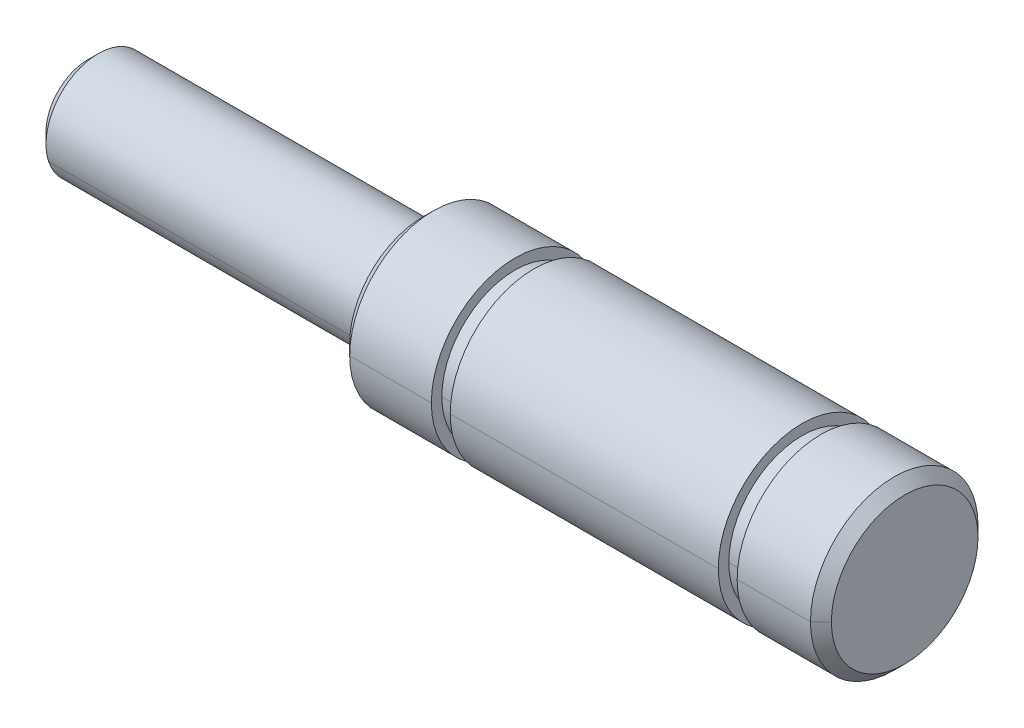
ISO-10303-21;
HEADER;
FILE_DESCRIPTION(('STEP AP214'),'2;1');
FILE_NAME('part.step','',(''),(''),'','','');
FILE_SCHEMA(('AUTOMOTIVE_DESIGN { 1 0 10303 214 1 1 1 1 }'));
ENDSEC;
DATA;
#1=APPLICATION_CONTEXT('core data for automotive mechanical design processes');
#2=APPLICATION_PROTOCOL_DEFINITION('international standard','automotive_design',2000,#1);
#3=PRODUCT_CONTEXT('',#1,'mechanical');
#4=PRODUCT('Part','Part','',(#3));
#5=PRODUCT_RELATED_PRODUCT_CATEGORY('part','',(#4));
#6=PRODUCT_DEFINITION_FORMATION('','',#4);
#7=PRODUCT_DEFINITION_CONTEXT('part definition',#1,'design');
#8=PRODUCT_DEFINITION('design','',#6,#7);
#9=PRODUCT_DEFINITION_SHAPE('','',#8);
#10=(LENGTH_UNIT() NAMED_UNIT(*) SI_UNIT(.MILLI.,.METRE.));
#11=(NAMED_UNIT(*) PLANE_ANGLE_UNIT() SI_UNIT($,.RADIAN.));
#12=(NAMED_UNIT(*) SI_UNIT($,.STERADIAN.) SOLID_ANGLE_UNIT());
#13=UNCERTAINTY_MEASURE_WITH_UNIT(LENGTH_MEASURE(1.E-05),#10,'distance_accuracy_value','');
#14=(GEOMETRIC_REPRESENTATION_CONTEXT(3) GLOBAL_UNCERTAINTY_ASSIGNED_CONTEXT((#13)) GLOBAL_UNIT_ASSIGNED_CONTEXT((#10,
#11,#12)) REPRESENTATION_CONTEXT('',''));
#15=CARTESIAN_POINT('',(0.,0.,0.));
#16=DIRECTION('',(0.,0.,1.));
#17=DIRECTION('',(1.,0.,0.));
#18=AXIS2_PLACEMENT_3D('',#15,#16,#17);
#19=CARTESIAN_POINT('',(23.,0.,0.));
#20=DIRECTION('',(1.,0.,0.));
#21=DIRECTION('',(0.,1.,0.));
#22=AXIS2_PLACEMENT_3D('',#19,#20,#21);
#23=CYLINDRICAL_SURFACE('',#22,4.);
#24=DIRECTION('',(1.,0.,0.));
#25=VECTOR('',#24,1.);
#26=CARTESIAN_POINT('',(5.3,0.,4.));
#27=LINE('',#26,#25);
#28=CARTESIAN_POINT('',(5.3,0.,4.));
#29=VERTEX_POINT('',#28);
#30=CARTESIAN_POINT('',(18.1,0.,4.));
#31=VERTEX_POINT('',#30);
#32=EDGE_CURVE('E11',#29,#31,#27,.T.);
#33=ORIENTED_EDGE('',*,*,#32,.F.);
#34=CARTESIAN_POINT('',(5.3,0.,0.));
#35=DIRECTION('',(1.,0.,0.));
#36=DIRECTION('',(0.,0.,-1.));
#37=AXIS2_PLACEMENT_3D('',#34,#35,#36);
#38=CIRCLE('',#37,4.);
#39=CARTESIAN_POINT('',(5.3,0.,-4.));
#40=VERTEX_POINT('',#39);
#41=EDGE_CURVE('E26',#29,#40,#38,.T.);
#42=ORIENTED_EDGE('',*,*,#41,.T.);
#43=DIRECTION('',(1.,0.,0.));
#44=VECTOR('',#43,1.);
#45=CARTESIAN_POINT('',(5.3,0.,-4.));
#46=LINE('',#45,#44);
#47=CARTESIAN_POINT('',(18.1,0.,-4.));
#48=VERTEX_POINT('',#47);
#49=EDGE_CURVE('E427',#40,#48,#46,.T.);
#50=ORIENTED_EDGE('',*,*,#49,.T.);
#51=CARTESIAN_POINT('',(18.1,0.,0.));
#52=DIRECTION('',(-1.,0.,0.));
#53=DIRECTION('',(0.,0.,1.));
#54=AXIS2_PLACEMENT_3D('',#51,#52,#53);
#55=CIRCLE('',#54,4.);
#56=EDGE_CURVE('E422',#48,#31,#55,.T.);
#57=ORIENTED_EDGE('',*,*,#56,.T.);
#58=EDGE_LOOP('',(#33,#42,#50,#57));
#59=FACE_BOUND('',#58,.T.);
#60=ADVANCED_FACE('F17',(#59),#23,.T.);
#61=CARTESIAN_POINT('',(18.1,8.,0.));
#62=DIRECTION('',(-1.,0.,0.));
#63=DIRECTION('',(0.,0.,1.));
#64=AXIS2_PLACEMENT_3D('',#61,#62,#63);
#65=PLANE('',#64);
#66=CARTESIAN_POINT('',(18.1,0.,0.));
#67=DIRECTION('',(1.,0.,0.));
#68=DIRECTION('',(0.,0.,-1.));
#69=AXIS2_PLACEMENT_3D('',#66,#67,#68);
#70=CIRCLE('',#69,3.5);
#71=CARTESIAN_POINT('',(18.1,0.,3.5));
#72=VERTEX_POINT('',#71);
#73=CARTESIAN_POINT('',(18.1,0.,-3.5));
#74=VERTEX_POINT('',#73);
#75=EDGE_CURVE('E416',#72,#74,#70,.T.);
#76=ORIENTED_EDGE('',*,*,#75,.F.);
#77=CARTESIAN_POINT('',(18.1,0.,0.));
#78=DIRECTION('',(1.,0.,0.));
#79=DIRECTION('',(0.,0.,-1.));
#80=AXIS2_PLACEMENT_3D('',#77,#78,#79);
#81=CIRCLE('',#80,3.5);
#82=EDGE_CURVE('E410',#74,#72,#81,.T.);
#83=ORIENTED_EDGE('',*,*,#82,.F.);
#84=EDGE_LOOP('',(#76,#83));
#85=FACE_BOUND('',#84,.T.);
#86=ORIENTED_EDGE('',*,*,#56,.F.);
#87=CARTESIAN_POINT('',(18.1,0.,0.));
#88=DIRECTION('',(-1.,0.,0.));
#89=DIRECTION('',(0.,0.,1.));
#90=AXIS2_PLACEMENT_3D('',#87,#88,#89);
#91=CIRCLE('',#90,4.);
#92=EDGE_CURVE('E404',#31,#48,#91,.T.);
#93=ORIENTED_EDGE('',*,*,#92,.F.);
#94=EDGE_LOOP('',(#86,#93));
#95=FACE_BOUND('',#94,.T.);
#96=ADVANCED_FACE('F522',(#85,#95),#65,.F.);
#97=CARTESIAN_POINT('',(23.,0.,0.));
#98=DIRECTION('',(1.,0.,0.));
#99=DIRECTION('',(0.,-1.,0.));
#100=AXIS2_PLACEMENT_3D('',#97,#98,#99);
#101=CYLINDRICAL_SURFACE('',#100,4.);
#102=ORIENTED_EDGE('',*,*,#32,.T.);
#103=ORIENTED_EDGE('',*,*,#92,.T.);
#104=ORIENTED_EDGE('',*,*,#49,.F.);
#105=CARTESIAN_POINT('',(5.3,0.,0.));
#106=DIRECTION('',(1.,0.,0.));
#107=DIRECTION('',(0.,0.,-1.));
#108=AXIS2_PLACEMENT_3D('',#105,#106,#107);
#109=CIRCLE('',#108,4.);
#110=EDGE_CURVE('E399',#40,#29,#109,.T.);
#111=ORIENTED_EDGE('',*,*,#110,.T.);
#112=EDGE_LOOP('',(#102,#103,#104,#111));
#113=FACE_BOUND('',#112,.T.);
#114=ADVANCED_FACE('F526',(#113),#101,.T.);
#115=CARTESIAN_POINT('',(5.3,3.5,0.));
#116=DIRECTION('',(1.,0.,0.));
#117=DIRECTION('',(0.,0.,-1.));
#118=AXIS2_PLACEMENT_3D('',#115,#116,#117);
#119=PLANE('',#118);
#120=ORIENTED_EDGE('',*,*,#41,.F.);
#121=ORIENTED_EDGE('',*,*,#110,.F.);
#122=EDGE_LOOP('',(#120,#121));
#123=FACE_BOUND('',#122,.T.);
#124=CARTESIAN_POINT('',(5.3,0.,0.));
#125=DIRECTION('',(1.,0.,0.));
#126=DIRECTION('',(0.,0.,-1.));
#127=AXIS2_PLACEMENT_3D('',#124,#125,#126);
#128=CIRCLE('',#127,3.5);
#129=CARTESIAN_POINT('',(5.3,0.,-3.5));
#130=VERTEX_POINT('',#129);
#131=CARTESIAN_POINT('',(5.3,0.,3.5));
#132=VERTEX_POINT('',#131);
#133=EDGE_CURVE('E394',#130,#132,#128,.T.);
#134=ORIENTED_EDGE('',*,*,#133,.T.);
#135=CARTESIAN_POINT('',(5.3,0.,0.));
#136=DIRECTION('',(1.,0.,0.));
#137=DIRECTION('',(0.,0.,-1.));
#138=AXIS2_PLACEMENT_3D('',#135,#136,#137);
#139=CIRCLE('',#138,3.5);
#140=EDGE_CURVE('E389',#132,#130,#139,.T.);
#141=ORIENTED_EDGE('',*,*,#140,.T.);
#142=EDGE_LOOP('',(#134,#141));
#143=FACE_BOUND('',#142,.T.);
#144=ADVANCED_FACE('F531',(#123,#143),#119,.F.);
#145=CARTESIAN_POINT('',(23.,0.,0.));
#146=DIRECTION('',(1.,0.,0.));
#147=DIRECTION('',(0.,1.,0.));
#148=AXIS2_PLACEMENT_3D('',#145,#146,#147);
#149=CYLINDRICAL_SURFACE('',#148,3.5);
#150=DIRECTION('',(1.,0.,0.));
#151=VECTOR('',#150,1.);
#152=CARTESIAN_POINT('',(4.4,0.,3.5));
#153=LINE('',#152,#151);
#154=CARTESIAN_POINT('',(4.4,0.,3.5));
#155=VERTEX_POINT('',#154);
#156=EDGE_CURVE('E383',#155,#132,#153,.T.);
#157=ORIENTED_EDGE('',*,*,#156,.F.);
#158=CARTESIAN_POINT('',(4.4,0.,0.));
#159=DIRECTION('',(1.,0.,0.));
#160=DIRECTION('',(0.,0.,-1.));
#161=AXIS2_PLACEMENT_3D('',#158,#159,#160);
#162=CIRCLE('',#161,3.5);
#163=CARTESIAN_POINT('',(4.4,0.,-3.5));
#164=VERTEX_POINT('',#163);
#165=EDGE_CURVE('E378',#155,#164,#162,.T.);
#166=ORIENTED_EDGE('',*,*,#165,.T.);
#167=DIRECTION('',(1.,0.,0.));
#168=VECTOR('',#167,1.);
#169=CARTESIAN_POINT('',(4.4,0.,-3.5));
#170=LINE('',#169,#168);
#171=EDGE_CURVE('E372',#164,#130,#170,.T.);
#172=ORIENTED_EDGE('',*,*,#171,.T.);
#173=ORIENTED_EDGE('',*,*,#140,.F.);
#174=EDGE_LOOP('',(#157,#166,#172,#173));
#175=FACE_BOUND('',#174,.T.);
#176=ADVANCED_FACE('F538',(#175),#149,.T.);
#177=CARTESIAN_POINT('',(23.,0.,0.));
#178=DIRECTION('',(1.,0.,0.));
#179=DIRECTION('',(0.,-1.,0.));
#180=AXIS2_PLACEMENT_3D('',#177,#178,#179);
#181=CYLINDRICAL_SURFACE('',#180,3.5);
#182=ORIENTED_EDGE('',*,*,#156,.T.);
#183=ORIENTED_EDGE('',*,*,#133,.F.);
#184=ORIENTED_EDGE('',*,*,#171,.F.);
#185=CARTESIAN_POINT('',(4.4,0.,0.));
#186=DIRECTION('',(1.,0.,0.));
#187=DIRECTION('',(0.,0.,-1.));
#188=AXIS2_PLACEMENT_3D('',#185,#186,#187);
#189=CIRCLE('',#188,3.5);
#190=EDGE_CURVE('E366',#164,#155,#189,.T.);
#191=ORIENTED_EDGE('',*,*,#190,.T.);
#192=EDGE_LOOP('',(#182,#183,#184,#191));
#193=FACE_BOUND('',#192,.T.);
#194=ADVANCED_FACE('F542',(#193),#181,.T.);
#195=CARTESIAN_POINT('',(4.4,8.,0.));
#196=DIRECTION('',(-1.,0.,0.));
#197=DIRECTION('',(0.,0.,1.));
#198=AXIS2_PLACEMENT_3D('',#195,#196,#197);
#199=PLANE('',#198);
#200=ORIENTED_EDGE('',*,*,#165,.F.);
#201=ORIENTED_EDGE('',*,*,#190,.F.);
#202=EDGE_LOOP('',(#200,#201));
#203=FACE_BOUND('',#202,.T.);
#204=CARTESIAN_POINT('',(4.4,0.,0.));
#205=DIRECTION('',(-1.,0.,0.));
#206=DIRECTION('',(0.,0.,1.));
#207=AXIS2_PLACEMENT_3D('',#204,#205,#206);
#208=CIRCLE('',#207,4.);
#209=CARTESIAN_POINT('',(4.4,0.,-4.));
#210=VERTEX_POINT('',#209);
#211=CARTESIAN_POINT('',(4.4,0.,4.));
#212=VERTEX_POINT('',#211);
#213=EDGE_CURVE('E360',#210,#212,#208,.T.);
#214=ORIENTED_EDGE('',*,*,#213,.F.);
#215=CARTESIAN_POINT('',(4.4,0.,0.));
#216=DIRECTION('',(-1.,0.,0.));
#217=DIRECTION('',(0.,0.,1.));
#218=AXIS2_PLACEMENT_3D('',#215,#216,#217);
#219=CIRCLE('',#218,4.);
#220=EDGE_CURVE('E354',#212,#210,#219,.T.);
#221=ORIENTED_EDGE('',*,*,#220,.F.);
#222=EDGE_LOOP('',(#214,#221));
#223=FACE_BOUND('',#222,.T.);
#224=ADVANCED_FACE('F546',(#203,#223),#199,.F.);
#225=CARTESIAN_POINT('',(23.,0.,0.));
#226=DIRECTION('',(1.,0.,0.));
#227=DIRECTION('',(0.,-1.,0.));
#228=AXIS2_PLACEMENT_3D('',#225,#226,#227);
#229=CYLINDRICAL_SURFACE('',#228,4.);
#230=DIRECTION('',(1.,0.,0.));
#231=VECTOR('',#230,1.);
#232=CARTESIAN_POINT('',(0.5,0.,4.));
#233=LINE('',#232,#231);
#234=CARTESIAN_POINT('',(0.5,0.,4.));
#235=VERTEX_POINT('',#234);
#236=EDGE_CURVE('E348',#235,#212,#233,.T.);
#237=ORIENTED_EDGE('',*,*,#236,.T.);
#238=ORIENTED_EDGE('',*,*,#220,.T.);
#239=DIRECTION('',(1.,0.,0.));
#240=VECTOR('',#239,1.);
#241=CARTESIAN_POINT('',(0.5,0.,-4.));
#242=LINE('',#241,#240);
#243=CARTESIAN_POINT('',(0.5,0.,-4.));
#244=VERTEX_POINT('',#243);
#245=EDGE_CURVE('E342',#244,#210,#242,.T.);
#246=ORIENTED_EDGE('',*,*,#245,.F.);
#247=CARTESIAN_POINT('',(0.5,0.,0.));
#248=DIRECTION('',(1.,0.,0.));
#249=DIRECTION('',(0.,0.,-1.));
#250=AXIS2_PLACEMENT_3D('',#247,#248,#249);
#251=CIRCLE('',#250,4.);
#252=EDGE_CURVE('E337',#244,#235,#251,.T.);
#253=ORIENTED_EDGE('',*,*,#252,.T.);
#254=EDGE_LOOP('',(#237,#238,#246,#253));
#255=FACE_BOUND('',#254,.T.);
#256=ADVANCED_FACE('F549',(#255),#229,.T.);
#257=CARTESIAN_POINT('',(0.,0.,0.));
#258=DIRECTION('',(1.,0.,0.));
#259=DIRECTION('',(0.,-1.,0.));
#260=AXIS2_PLACEMENT_3D('',#257,#258,#259);
#261=CONICAL_SURFACE('',#260,3.5,0.785398163397448);
#262=DIRECTION('',(0.707106781186548,0.,0.707106781186547));
#263=VECTOR('',#262,1.);
#264=CARTESIAN_POINT('',(0.,0.,3.5));
#265=LINE('',#264,#263);
#266=CARTESIAN_POINT('',(0.,0.,3.5));
#267=VERTEX_POINT('',#266);
#268=EDGE_CURVE('E331',#267,#235,#265,.T.);
#269=ORIENTED_EDGE('',*,*,#268,.T.);
#270=ORIENTED_EDGE('',*,*,#252,.F.);
#271=DIRECTION('',(0.707106781186548,0.,-0.707106781186547));
#272=VECTOR('',#271,1.);
#273=CARTESIAN_POINT('',(0.,0.,-3.5));
#274=LINE('',#273,#272);
#275=CARTESIAN_POINT('',(0.,0.,-3.5));
#276=VERTEX_POINT('',#275);
#277=EDGE_CURVE('E325',#276,#244,#274,.T.);
#278=ORIENTED_EDGE('',*,*,#277,.F.);
#279=CARTESIAN_POINT('',(0.,0.,0.));
#280=DIRECTION('',(1.,0.,0.));
#281=DIRECTION('',(0.,0.,-1.));
#282=AXIS2_PLACEMENT_3D('',#279,#280,#281);
#283=CIRCLE('',#282,3.5);
#284=EDGE_CURVE('E320',#276,#267,#283,.T.);
#285=ORIENTED_EDGE('',*,*,#284,.T.);
#286=EDGE_LOOP('',(#269,#270,#278,#285));
#287=FACE_BOUND('',#286,.T.);
#288=ADVANCED_FACE('F297',(#287),#261,.T.);
#289=CARTESIAN_POINT('',(0.,2.7,0.));
#290=DIRECTION('',(1.,0.,0.));
#291=DIRECTION('',(0.,0.,-1.));
#292=AXIS2_PLACEMENT_3D('',#289,#290,#291);
#293=PLANE('',#292);
#294=CARTESIAN_POINT('',(0.,0.,0.));
#295=DIRECTION('',(1.,0.,0.));
#296=DIRECTION('',(0.,0.,-1.));
#297=AXIS2_PLACEMENT_3D('',#294,#295,#296);
#298=CIRCLE('',#297,3.5);
#299=EDGE_CURVE('E316',#267,#276,#298,.T.);
#300=ORIENTED_EDGE('',*,*,#299,.F.);
#301=ORIENTED_EDGE('',*,*,#284,.F.);
#302=EDGE_LOOP('',(#300,#301));
#303=FACE_BOUND('',#302,.T.);
#304=CARTESIAN_POINT('',(0.,-2.56785259399692,-0.834345884812358));
#305=CARTESIAN_POINT('',(0.,-2.3054894173888,-1.64070183667632));
#306=CARTESIAN_POINT('',(0.,-1.72788534034163,-2.34633383783401));
#307=CARTESIAN_POINT('',(0.,-0.882106735192525,-2.77618217061076));
#308=CARTESIAN_POINT('',(0.,0.93702599862815,-2.88386948988305));
#309=CARTESIAN_POINT('',(0.,2.34543827718565,-1.72748922561081));
#310=CARTESIAN_POINT('',(0.,2.77702903150137,-0.882598428579526));
#311=CARTESIAN_POINT('',(0.,2.82956046202664,0.0277770102841628));
#312=CARTESIAN_POINT('',(0.,2.56785259399692,0.834345884812357));
#313=B_SPLINE_CURVE_WITH_KNOTS('',5,(#304,#305,#306,#307,#308,#309,#310,#311,#312),
.UNSPECIFIED.,.F.,.F.,(6,3,6),(0.,1.5707963267949,3.14159265358979),.UNSPECIFIED.);
#314=CARTESIAN_POINT('',(0.,-2.56785259399692,-0.834345884812358));
#315=VERTEX_POINT('',#314);
#316=CARTESIAN_POINT('',(0.,2.56785259399692,0.834345884812358));
#317=VERTEX_POINT('',#316);
#318=EDGE_CURVE('E314',#315,#317,#313,.T.);
#319=ORIENTED_EDGE('',*,*,#318,.T.);
#320=CARTESIAN_POINT('',(0.,0.,0.));
#321=DIRECTION('',(1.,0.,0.));
#322=DIRECTION('',(0.,0.,-1.));
#323=AXIS2_PLACEMENT_3D('',#320,#321,#322);
#324=CIRCLE('',#323,2.7);
#325=EDGE_CURVE('E441',#317,#315,#324,.T.);
#326=ORIENTED_EDGE('',*,*,#325,.T.);
#327=EDGE_LOOP('',(#319,#326));
#328=FACE_BOUND('',#327,.T.);
#329=ADVANCED_FACE('F292',(#303,#328),#293,.F.);
#330=CARTESIAN_POINT('',(-0.200000000000015,0.,0.));
#331=DIRECTION('',(1.,0.,0.));
#332=DIRECTION('',(0.,0.309016994374947,-0.951056516295154));
#333=AXIS2_PLACEMENT_3D('',#330,#331,#332);
#334=TOROIDAL_SURFACE('',#333,2.7,0.200000000000015);
#335=CARTESIAN_POINT('',(-0.200000000000015,-2.56785259399692,-0.834345884812357));
#336=DIRECTION('',(0.,0.309016994374948,-0.951056516295154));
#337=DIRECTION('',(0.,0.951056516295154,0.309016994374948));
#338=AXIS2_PLACEMENT_3D('',#335,#336,#337);
#339=CIRCLE('',#338,0.200000000000015);
#340=CARTESIAN_POINT('',(-0.2,-2.37764129073787,-0.772542485937363));
#341=VERTEX_POINT('',#340);
#342=EDGE_CURVE('E443',#341,#315,#339,.T.);
#343=ORIENTED_EDGE('',*,*,#342,.T.);
#344=ORIENTED_EDGE('',*,*,#325,.F.);
#345=CARTESIAN_POINT('',(-0.200000000000015,2.56785259399692,0.834345884812358));
#346=DIRECTION('',(0.,-0.309016994374948,0.951056516295154));
#347=DIRECTION('',(0.,-0.951056516295154,-0.309016994374948));
#348=AXIS2_PLACEMENT_3D('',#345,#346,#347);
#349=CIRCLE('',#348,0.200000000000015);
#350=CARTESIAN_POINT('',(-0.2,2.37764129073787,0.772542485937364));
#351=VERTEX_POINT('',#350);
#352=EDGE_CURVE('E446',#351,#317,#349,.T.);
#353=ORIENTED_EDGE('',*,*,#352,.F.);
#354=CARTESIAN_POINT('',(-0.2,0.,0.));
#355=DIRECTION('',(1.,0.,0.));
#356=DIRECTION('',(0.,0.,-1.));
#357=AXIS2_PLACEMENT_3D('',#354,#355,#356);
#358=CIRCLE('',#357,2.5);
#359=CARTESIAN_POINT('',(-0.199999999999999,-0.772542485937367,2.37764129073788));
#360=VERTEX_POINT('',#359);
#361=EDGE_CURVE('E449',#351,#360,#358,.T.);
#362=ORIENTED_EDGE('',*,*,#361,.T.);
#363=CARTESIAN_POINT('',(-0.2,0.,0.));
#364=DIRECTION('',(1.,0.,0.));
#365=DIRECTION('',(0.,0.,-1.));
#366=AXIS2_PLACEMENT_3D('',#363,#364,#365);
#367=CIRCLE('',#366,2.5);
#368=EDGE_CURVE('E452',#360,#341,#367,.T.);
#369=ORIENTED_EDGE('',*,*,#368,.T.);
#370=EDGE_LOOP('',(#343,#344,#353,#362,#369));
#371=FACE_BOUND('',#370,.T.);
#372=ADVANCED_FACE('F288',(#371),#334,.F.);
#373=CARTESIAN_POINT('',(23.,0.,0.));
#374=DIRECTION('',(1.,0.,0.));
#375=DIRECTION('',(0.,0.987688340595138,0.156434465040231));
#376=AXIS2_PLACEMENT_3D('',#373,#374,#375);
#377=CYLINDRICAL_SURFACE('',#376,2.5);
#378=DIRECTION('',(1.,0.,0.));
#379=VECTOR('',#378,1.);
#380=CARTESIAN_POINT('',(-15.5,-0.772542485937367,2.37764129073788));
#381=LINE('',#380,#379);
#382=CARTESIAN_POINT('',(-15.5,-0.772542485937367,2.37764129073788));
#383=VERTEX_POINT('',#382);
#384=EDGE_CURVE('E455',#383,#360,#381,.T.);
#385=ORIENTED_EDGE('',*,*,#384,.F.);
#386=CARTESIAN_POINT('',(-15.5,0.,0.));
#387=DIRECTION('',(1.,0.,0.));
#388=DIRECTION('',(0.,0.,-1.));
#389=AXIS2_PLACEMENT_3D('',#386,#387,#388);
#390=CIRCLE('',#389,2.5);
#391=CARTESIAN_POINT('',(-15.5,0.,-2.5));
#392=VERTEX_POINT('',#391);
#393=EDGE_CURVE('E459',#383,#392,#390,.T.);
#394=ORIENTED_EDGE('',*,*,#393,.T.);
#395=DIRECTION('',(1.,0.,0.));
#396=VECTOR('',#395,1.);
#397=CARTESIAN_POINT('',(-15.5,0.,-2.5));
#398=LINE('',#397,#396);
#399=CARTESIAN_POINT('',(-0.2,0.,-2.5));
#400=VERTEX_POINT('',#399);
#401=EDGE_CURVE('E462',#392,#400,#398,.T.);
#402=ORIENTED_EDGE('',*,*,#401,.T.);
#403=CARTESIAN_POINT('',(-0.2,0.,0.));
#404=DIRECTION('',(1.,0.,0.));
#405=DIRECTION('',(0.,0.,-1.));
#406=AXIS2_PLACEMENT_3D('',#403,#404,#405);
#407=CIRCLE('',#406,2.5);
#408=EDGE_CURVE('E465',#341,#400,#407,.T.);
#409=ORIENTED_EDGE('',*,*,#408,.F.);
#410=ORIENTED_EDGE('',*,*,#368,.F.);
#411=EDGE_LOOP('',(#385,#394,#402,#409,#410));
#412=FACE_BOUND('',#411,.T.);
#413=ADVANCED_FACE('F283',(#412),#377,.T.);
#414=CARTESIAN_POINT('',(-0.200000000000015,0.,0.));
#415=DIRECTION('',(1.,0.,0.));
#416=DIRECTION('',(0.,-0.309016994374947,0.951056516295154));
#417=AXIS2_PLACEMENT_3D('',#414,#415,#416);
#418=TOROIDAL_SURFACE('',#417,2.7,0.200000000000015);
#419=ORIENTED_EDGE('',*,*,#342,.F.);
#420=ORIENTED_EDGE('',*,*,#408,.T.);
#421=CARTESIAN_POINT('',(-0.2,0.,0.));
#422=DIRECTION('',(1.,0.,0.));
#423=DIRECTION('',(0.,0.,-1.));
#424=AXIS2_PLACEMENT_3D('',#421,#422,#423);
#425=CIRCLE('',#424,2.5);
#426=EDGE_CURVE('E263',#400,#351,#425,.T.);
#427=ORIENTED_EDGE('',*,*,#426,.T.);
#428=ORIENTED_EDGE('',*,*,#352,.T.);
#429=ORIENTED_EDGE('',*,*,#318,.F.);
#430=EDGE_LOOP('',(#419,#420,#427,#428,#429));
#431=FACE_BOUND('',#430,.T.);
#432=ADVANCED_FACE('F272',(#431),#418,.F.);
#433=CARTESIAN_POINT('',(23.,0.,0.));
#434=DIRECTION('',(1.,0.,0.));
#435=DIRECTION('',(0.,-0.987688340595138,-0.156434465040231));
#436=AXIS2_PLACEMENT_3D('',#433,#434,#435);
#437=CYLINDRICAL_SURFACE('',#436,2.5);
#438=ORIENTED_EDGE('',*,*,#384,.T.);
#439=ORIENTED_EDGE('',*,*,#361,.F.);
#440=ORIENTED_EDGE('',*,*,#426,.F.);
#441=ORIENTED_EDGE('',*,*,#401,.F.);
#442=CARTESIAN_POINT('',(-15.5,0.,0.));
#443=DIRECTION('',(1.,0.,0.));
#444=DIRECTION('',(0.,0.,-1.));
#445=AXIS2_PLACEMENT_3D('',#442,#443,#444);
#446=CIRCLE('',#445,2.5);
#447=CARTESIAN_POINT('',(-15.5,0.,2.5));
#448=VERTEX_POINT('',#447);
#449=EDGE_CURVE('E258',#392,#448,#446,.T.);
#450=ORIENTED_EDGE('',*,*,#449,.T.);
#451=CARTESIAN_POINT('',(-15.5,0.,0.));
#452=DIRECTION('',(1.,0.,0.));
#453=DIRECTION('',(0.,0.,-1.));
#454=AXIS2_PLACEMENT_3D('',#451,#452,#453);
#455=CIRCLE('',#454,2.5);
#456=EDGE_CURVE('E252',#448,#383,#455,.T.);
#457=ORIENTED_EDGE('',*,*,#456,.T.);
#458=EDGE_LOOP('',(#438,#439,#440,#441,#450,#457));
#459=FACE_BOUND('',#458,.T.);
#460=ADVANCED_FACE('F282',(#459),#437,.T.);
#461=CARTESIAN_POINT('',(-16.,0.,0.));
#462=DIRECTION('',(1.,0.,0.));
#463=DIRECTION('',(0.,1.,0.));
#464=AXIS2_PLACEMENT_3D('',#461,#462,#463);
#465=CONICAL_SURFACE('',#464,2.,0.785398163397448);
#466=DIRECTION('',(0.707106781186548,0.,0.707106781186547));
#467=VECTOR('',#466,1.);
#468=CARTESIAN_POINT('',(-16.,0.,2.));
#469=LINE('',#468,#467);
#470=CARTESIAN_POINT('',(-16.,0.,2.));
#471=VERTEX_POINT('',#470);
#472=EDGE_CURVE('E246',#471,#448,#469,.T.);
#473=ORIENTED_EDGE('',*,*,#472,.F.);
#474=CARTESIAN_POINT('',(-16.,0.,0.));
#475=DIRECTION('',(1.,0.,0.));
#476=DIRECTION('',(0.,0.,-1.));
#477=AXIS2_PLACEMENT_3D('',#474,#475,#476);
#478=CIRCLE('',#477,2.);
#479=CARTESIAN_POINT('',(-16.,0.,-2.));
#480=VERTEX_POINT('',#479);
#481=EDGE_CURVE('E241',#471,#480,#478,.T.);
#482=ORIENTED_EDGE('',*,*,#481,.T.);
#483=DIRECTION('',(0.707106781186548,0.,-0.707106781186547));
#484=VECTOR('',#483,1.);
#485=CARTESIAN_POINT('',(-16.,0.,-2.));
#486=LINE('',#485,#484);
#487=EDGE_CURVE('E235',#480,#392,#486,.T.);
#488=ORIENTED_EDGE('',*,*,#487,.T.);
#489=ORIENTED_EDGE('',*,*,#393,.F.);
#490=ORIENTED_EDGE('',*,*,#456,.F.);
#491=EDGE_LOOP('',(#473,#482,#488,#489,#490));
#492=FACE_BOUND('',#491,.T.);
#493=ADVANCED_FACE('F506',(#492),#465,.T.);
#494=CARTESIAN_POINT('',(-16.,0.,0.));
#495=DIRECTION('',(1.,0.,0.));
#496=DIRECTION('',(0.,-1.,0.));
#497=AXIS2_PLACEMENT_3D('',#494,#495,#496);
#498=CONICAL_SURFACE('',#497,2.,0.785398163397448);
#499=ORIENTED_EDGE('',*,*,#472,.T.);
#500=ORIENTED_EDGE('',*,*,#449,.F.);
#501=ORIENTED_EDGE('',*,*,#487,.F.);
#502=CARTESIAN_POINT('',(-16.,0.,0.));
#503=DIRECTION('',(1.,0.,0.));
#504=DIRECTION('',(0.,0.,-1.));
#505=AXIS2_PLACEMENT_3D('',#502,#503,#504);
#506=CIRCLE('',#505,2.);
#507=EDGE_CURVE('E229',#480,#471,#506,.T.);
#508=ORIENTED_EDGE('',*,*,#507,.T.);
#509=EDGE_LOOP('',(#499,#500,#501,#508));
#510=FACE_BOUND('',#509,.T.);
#511=ADVANCED_FACE('F502',(#510),#498,.T.);
#512=CARTESIAN_POINT('',(-16.,0.,0.));
#513=DIRECTION('',(1.,0.,0.));
#514=DIRECTION('',(0.,0.,-1.));
#515=AXIS2_PLACEMENT_3D('',#512,#513,#514);
#516=PLANE('',#515);
#517=ORIENTED_EDGE('',*,*,#481,.F.);
#518=ORIENTED_EDGE('',*,*,#507,.F.);
#519=EDGE_LOOP('',(#517,#518));
#520=FACE_BOUND('',#519,.T.);
#521=ADVANCED_FACE('F508',(#520),#516,.F.);
#522=CARTESIAN_POINT('',(0.,0.,0.));
#523=DIRECTION('',(1.,0.,0.));
#524=DIRECTION('',(0.,1.,0.));
#525=AXIS2_PLACEMENT_3D('',#522,#523,#524);
#526=CONICAL_SURFACE('',#525,3.5,0.785398163397448);
#527=ORIENTED_EDGE('',*,*,#268,.F.);
#528=ORIENTED_EDGE('',*,*,#299,.T.);
#529=ORIENTED_EDGE('',*,*,#277,.T.);
#530=CARTESIAN_POINT('',(0.5,0.,0.));
#531=DIRECTION('',(1.,0.,0.));
#532=DIRECTION('',(0.,0.,-1.));
#533=AXIS2_PLACEMENT_3D('',#530,#531,#532);
#534=CIRCLE('',#533,4.);
#535=EDGE_CURVE('E223',#235,#244,#534,.T.);
#536=ORIENTED_EDGE('',*,*,#535,.F.);
#537=EDGE_LOOP('',(#527,#528,#529,#536));
#538=FACE_BOUND('',#537,.T.);
#539=ADVANCED_FACE('F510',(#538),#526,.T.);
#540=CARTESIAN_POINT('',(23.,0.,0.));
#541=DIRECTION('',(1.,0.,0.));
#542=DIRECTION('',(0.,1.,0.));
#543=AXIS2_PLACEMENT_3D('',#540,#541,#542);
#544=CYLINDRICAL_SURFACE('',#543,4.);
#545=ORIENTED_EDGE('',*,*,#236,.F.);
#546=ORIENTED_EDGE('',*,*,#535,.T.);
#547=ORIENTED_EDGE('',*,*,#245,.T.);
#548=ORIENTED_EDGE('',*,*,#213,.T.);
#549=EDGE_LOOP('',(#545,#546,#547,#548));
#550=FACE_BOUND('',#549,.T.);
#551=ADVANCED_FACE('F517',(#550),#544,.T.);
#552=CARTESIAN_POINT('',(23.,0.,0.));
#553=DIRECTION('',(1.,0.,0.));
#554=DIRECTION('',(0.,-1.,0.));
#555=AXIS2_PLACEMENT_3D('',#552,#553,#554);
#556=CYLINDRICAL_SURFACE('',#555,3.5);
#557=DIRECTION('',(1.,0.,0.));
#558=VECTOR('',#557,1.);
#559=CARTESIAN_POINT('',(18.1,0.,3.5));
#560=LINE('',#559,#558);
#561=CARTESIAN_POINT('',(19.,0.,3.5));
#562=VERTEX_POINT('',#561);
#563=EDGE_CURVE('E218',#72,#562,#560,.T.);
#564=ORIENTED_EDGE('',*,*,#563,.T.);
#565=CARTESIAN_POINT('',(19.,0.,0.));
#566=DIRECTION('',(1.,0.,0.));
#567=DIRECTION('',(0.,0.,-1.));
#568=AXIS2_PLACEMENT_3D('',#565,#566,#567);
#569=CIRCLE('',#568,3.5);
#570=CARTESIAN_POINT('',(19.,0.,-3.5));
#571=VERTEX_POINT('',#570);
#572=EDGE_CURVE('E212',#571,#562,#569,.T.);
#573=ORIENTED_EDGE('',*,*,#572,.F.);
#574=DIRECTION('',(1.,0.,0.));
#575=VECTOR('',#574,1.);
#576=CARTESIAN_POINT('',(18.1,0.,-3.5));
#577=LINE('',#576,#575);
#578=EDGE_CURVE('E206',#74,#571,#577,.T.);
#579=ORIENTED_EDGE('',*,*,#578,.F.);
#580=ORIENTED_EDGE('',*,*,#82,.T.);
#581=EDGE_LOOP('',(#564,#573,#579,#580));
#582=FACE_BOUND('',#581,.T.);
#583=ADVANCED_FACE('F566',(#582),#556,.T.);
#584=CARTESIAN_POINT('',(23.,0.,0.));
#585=DIRECTION('',(1.,0.,0.));
#586=DIRECTION('',(0.,1.,0.));
#587=AXIS2_PLACEMENT_3D('',#584,#585,#586);
#588=CYLINDRICAL_SURFACE('',#587,3.5);
#589=ORIENTED_EDGE('',*,*,#563,.F.);
#590=ORIENTED_EDGE('',*,*,#75,.T.);
#591=ORIENTED_EDGE('',*,*,#578,.T.);
#592=CARTESIAN_POINT('',(19.,0.,0.));
#593=DIRECTION('',(1.,0.,0.));
#594=DIRECTION('',(0.,0.,-1.));
#595=AXIS2_PLACEMENT_3D('',#592,#593,#594);
#596=CIRCLE('',#595,3.5);
#597=EDGE_CURVE('E200',#562,#571,#596,.T.);
#598=ORIENTED_EDGE('',*,*,#597,.F.);
#599=EDGE_LOOP('',(#589,#590,#591,#598));
#600=FACE_BOUND('',#599,.T.);
#601=ADVANCED_FACE('F571',(#600),#588,.T.);
#602=CARTESIAN_POINT('',(19.,3.5,0.));
#603=DIRECTION('',(1.,0.,0.));
#604=DIRECTION('',(0.,0.,-1.));
#605=AXIS2_PLACEMENT_3D('',#602,#603,#604);
#606=PLANE('',#605);
#607=CARTESIAN_POINT('',(19.,0.,0.));
#608=DIRECTION('',(1.,0.,0.));
#609=DIRECTION('',(0.,0.,-1.));
#610=AXIS2_PLACEMENT_3D('',#607,#608,#609);
#611=CIRCLE('',#610,4.);
#612=CARTESIAN_POINT('',(19.,0.,4.));
#613=VERTEX_POINT('',#612);
#614=CARTESIAN_POINT('',(19.,0.,-4.));
#615=VERTEX_POINT('',#614);
#616=EDGE_CURVE('E194',#613,#615,#611,.T.);
#617=ORIENTED_EDGE('',*,*,#616,.F.);
#618=CARTESIAN_POINT('',(19.,0.,0.));
#619=DIRECTION('',(1.,0.,0.));
#620=DIRECTION('',(0.,0.,-1.));
#621=AXIS2_PLACEMENT_3D('',#618,#619,#620);
#622=CIRCLE('',#621,4.);
#623=EDGE_CURVE('E188',#615,#613,#622,.T.);
#624=ORIENTED_EDGE('',*,*,#623,.F.);
#625=EDGE_LOOP('',(#617,#624));
#626=FACE_BOUND('',#625,.T.);
#627=ORIENTED_EDGE('',*,*,#572,.T.);
#628=ORIENTED_EDGE('',*,*,#597,.T.);
#629=EDGE_LOOP('',(#627,#628));
#630=FACE_BOUND('',#629,.T.);
#631=ADVANCED_FACE('F577',(#626,#630),#606,.F.);
#632=CARTESIAN_POINT('',(23.,0.,0.));
#633=DIRECTION('',(1.,0.,0.));
#634=DIRECTION('',(0.,-1.,0.));
#635=AXIS2_PLACEMENT_3D('',#632,#633,#634);
#636=CYLINDRICAL_SURFACE('',#635,4.);
#637=DIRECTION('',(1.,0.,0.));
#638=VECTOR('',#637,1.);
#639=CARTESIAN_POINT('',(19.,0.,4.));
#640=LINE('',#639,#638);
#641=CARTESIAN_POINT('',(22.5,0.,4.));
#642=VERTEX_POINT('',#641);
#643=EDGE_CURVE('E183',#613,#642,#640,.T.);
#644=ORIENTED_EDGE('',*,*,#643,.T.);
#645=CARTESIAN_POINT('',(22.5,0.,0.));
#646=DIRECTION('',(1.,0.,0.));
#647=DIRECTION('',(0.,0.,-1.));
#648=AXIS2_PLACEMENT_3D('',#645,#646,#647);
#649=CIRCLE('',#648,4.);
#650=CARTESIAN_POINT('',(22.5,0.,-4.));
#651=VERTEX_POINT('',#650);
#652=EDGE_CURVE('E155',#651,#642,#649,.T.);
#653=ORIENTED_EDGE('',*,*,#652,.F.);
#654=DIRECTION('',(1.,0.,0.));
#655=VECTOR('',#654,1.);
#656=CARTESIAN_POINT('',(19.,0.,-4.));
#657=LINE('',#656,#655);
#658=EDGE_CURVE('E173',#615,#651,#657,.T.);
#659=ORIENTED_EDGE('',*,*,#658,.F.);
#660=ORIENTED_EDGE('',*,*,#623,.T.);
#661=EDGE_LOOP('',(#644,#653,#659,#660));
#662=FACE_BOUND('',#661,.T.);
#663=ADVANCED_FACE('F581',(#662),#636,.T.);
#664=CARTESIAN_POINT('',(23.,0.,0.));
#665=DIRECTION('',(1.,0.,0.));
#666=DIRECTION('',(0.,1.,-5.8935951136395E-10));
#667=AXIS2_PLACEMENT_3D('',#664,#665,#666);
#668=CYLINDRICAL_SURFACE('',#667,4.);
#669=ORIENTED_EDGE('',*,*,#643,.F.);
#670=ORIENTED_EDGE('',*,*,#616,.T.);
#671=ORIENTED_EDGE('',*,*,#658,.T.);
#672=CARTESIAN_POINT('',(22.5,0.,0.));
#673=DIRECTION('',(1.,0.,0.));
#674=DIRECTION('',(0.,0.,-1.));
#675=AXIS2_PLACEMENT_3D('',#672,#673,#674);
#676=CIRCLE('',#675,4.);
#677=EDGE_CURVE('E168',#642,#651,#676,.T.);
#678=ORIENTED_EDGE('',*,*,#677,.F.);
#679=EDGE_LOOP('',(#669,#670,#671,#678));
#680=FACE_BOUND('',#679,.T.);
#681=ADVANCED_FACE('F585',(#680),#668,.T.);
#682=CARTESIAN_POINT('',(22.5,0.,0.));
#683=DIRECTION('',(-1.,0.,0.));
#684=DIRECTION('',(0.,1.,0.));
#685=AXIS2_PLACEMENT_3D('',#682,#683,#684);
#686=CONICAL_SURFACE('',#685,4.,0.785398163397448);
#687=DIRECTION('',(-0.707106781186548,0.,-0.707106781186547));
#688=VECTOR('',#687,1.);
#689=CARTESIAN_POINT('',(23.,0.,-3.5));
#690=LINE('',#689,#688);
#691=CARTESIAN_POINT('',(23.,0.,-3.5));
#692=VERTEX_POINT('',#691);
#693=EDGE_CURVE('E144',#692,#651,#690,.T.);
#694=ORIENTED_EDGE('',*,*,#693,.F.);
#695=CARTESIAN_POINT('',(23.,0.,0.));
#696=DIRECTION('',(1.,0.,0.));
#697=DIRECTION('',(0.,0.,-1.));
#698=AXIS2_PLACEMENT_3D('',#695,#696,#697);
#699=CIRCLE('',#698,3.5);
#700=CARTESIAN_POINT('',(23.,0.,3.5));
#701=VERTEX_POINT('',#700);
#702=EDGE_CURVE('E136',#701,#692,#699,.T.);
#703=ORIENTED_EDGE('',*,*,#702,.F.);
#704=DIRECTION('',(-0.707106781186548,0.,0.707106781186547));
#705=VECTOR('',#704,1.);
#706=CARTESIAN_POINT('',(23.,0.,3.5));
#707=LINE('',#706,#705);
#708=EDGE_CURVE('E141',#701,#642,#707,.T.);
#709=ORIENTED_EDGE('',*,*,#708,.T.);
#710=ORIENTED_EDGE('',*,*,#677,.T.);
#711=EDGE_LOOP('',(#694,#703,#709,#710));
#712=FACE_BOUND('',#711,.T.);
#713=ADVANCED_FACE('F138',(#712),#686,.T.);
#714=CARTESIAN_POINT('',(22.5,0.,0.));
#715=DIRECTION('',(-1.,0.,0.));
#716=DIRECTION('',(0.,-1.,0.));
#717=AXIS2_PLACEMENT_3D('',#714,#715,#716);
#718=CONICAL_SURFACE('',#717,4.,0.785398163397448);
#719=ORIENTED_EDGE('',*,*,#693,.T.);
#720=ORIENTED_EDGE('',*,*,#652,.T.);
#721=ORIENTED_EDGE('',*,*,#708,.F.);
#722=CARTESIAN_POINT('',(23.,0.,0.));
#723=DIRECTION('',(1.,0.,0.));
#724=DIRECTION('',(0.,0.,-1.));
#725=AXIS2_PLACEMENT_3D('',#722,#723,#724);
#726=CIRCLE('',#725,3.5);
#727=EDGE_CURVE('E149',#692,#701,#726,.T.);
#728=ORIENTED_EDGE('',*,*,#727,.F.);
#729=EDGE_LOOP('',(#719,#720,#721,#728));
#730=FACE_BOUND('',#729,.T.);
#731=ADVANCED_FACE('F154',(#730),#718,.T.);
#732=CARTESIAN_POINT('',(23.,3.5,0.));
#733=DIRECTION('',(-1.,0.,0.));
#734=DIRECTION('',(0.,0.,1.));
#735=AXIS2_PLACEMENT_3D('',#732,#733,#734);
#736=PLANE('',#735);
#737=ORIENTED_EDGE('',*,*,#727,.T.);
#738=ORIENTED_EDGE('',*,*,#702,.T.);
#739=EDGE_LOOP('',(#737,#738));
#740=FACE_BOUND('',#739,.T.);
#741=ADVANCED_FACE('F150',(#740),#736,.F.);
#742=CLOSED_SHELL('',(#60,#96,#114,#144,#176,#194,#224,#256,#288,#329,#372,#413,#432,#460,#493,
#511,#521,#539,#551,#583,#601,#631,#663,#681,#713,#731,#741));
#743=MANIFOLD_SOLID_BREP('B1',#742);
#744=ADVANCED_BREP_SHAPE_REPRESENTATION('',(#18,#743),#14);
#745=SHAPE_DEFINITION_REPRESENTATION(#9,#744);
ENDSEC;
END-ISO-10303-21;
